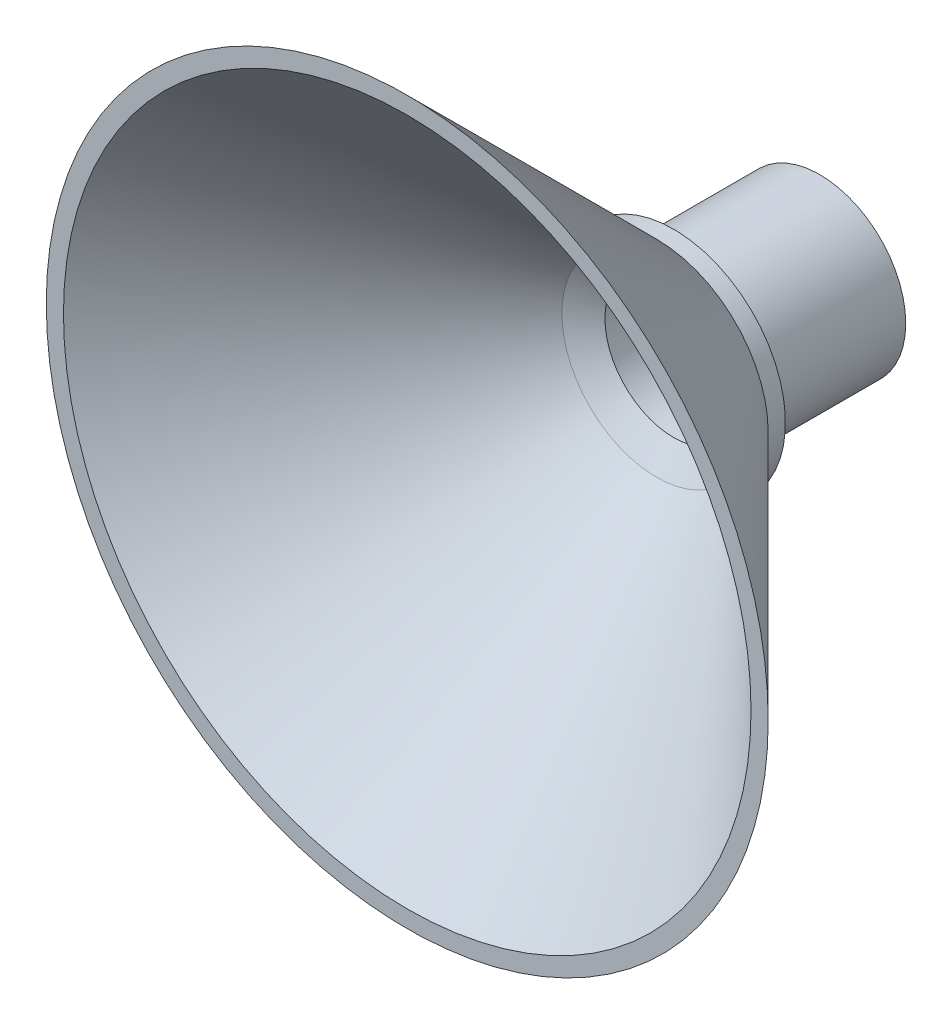
ISO-10303-21;
HEADER;
FILE_DESCRIPTION(('STEP AP214'),'2;1');
FILE_NAME('part.step','',(''),(''),'','','');
FILE_SCHEMA(('AUTOMOTIVE_DESIGN { 1 0 10303 214 1 1 1 1 }'));
ENDSEC;
DATA;
#1=APPLICATION_CONTEXT('core data for automotive mechanical design processes');
#2=APPLICATION_PROTOCOL_DEFINITION('international standard','automotive_design',2000,#1);
#3=PRODUCT_CONTEXT('',#1,'mechanical');
#4=PRODUCT('Part','Part','',(#3));
#5=PRODUCT_RELATED_PRODUCT_CATEGORY('part','',(#4));
#6=PRODUCT_DEFINITION_FORMATION('','',#4);
#7=PRODUCT_DEFINITION_CONTEXT('part definition',#1,'design');
#8=PRODUCT_DEFINITION('design','',#6,#7);
#9=PRODUCT_DEFINITION_SHAPE('','',#8);
#10=(LENGTH_UNIT() NAMED_UNIT(*) SI_UNIT(.MILLI.,.METRE.));
#11=(NAMED_UNIT(*) PLANE_ANGLE_UNIT() SI_UNIT($,.RADIAN.));
#12=(NAMED_UNIT(*) SI_UNIT($,.STERADIAN.) SOLID_ANGLE_UNIT());
#13=UNCERTAINTY_MEASURE_WITH_UNIT(LENGTH_MEASURE(1.E-05),#10,'distance_accuracy_value','');
#14=(GEOMETRIC_REPRESENTATION_CONTEXT(3) GLOBAL_UNCERTAINTY_ASSIGNED_CONTEXT((#13)) GLOBAL_UNIT_ASSIGNED_CONTEXT((#10,
#11,#12)) REPRESENTATION_CONTEXT('',''));
#15=CARTESIAN_POINT('',(0.,0.,0.));
#16=DIRECTION('',(0.,0.,1.));
#17=DIRECTION('',(1.,0.,0.));
#18=AXIS2_PLACEMENT_3D('',#15,#16,#17);
#19=CARTESIAN_POINT('',(0.,0.,0.));
#20=DIRECTION('',(0.,0.,1.));
#21=DIRECTION('',(1.,0.,0.));
#22=AXIS2_PLACEMENT_3D('',#19,#20,#21);
#23=PLANE('',#22);
#24=CARTESIAN_POINT('',(0.,0.,0.));
#25=DIRECTION('',(0.,0.,1.));
#26=DIRECTION('',(1.,0.,0.));
#27=AXIS2_PLACEMENT_3D('',#24,#25,#26);
#28=CIRCLE('',#27,10.);
#29=CARTESIAN_POINT('',(10.,0.,0.));
#30=VERTEX_POINT('',#29);
#31=EDGE_CURVE('E43',#30,#30,#28,.T.);
#32=ORIENTED_EDGE('',*,*,#31,.F.);
#33=EDGE_LOOP('',(#32));
#34=FACE_BOUND('',#33,.T.);
#35=CARTESIAN_POINT('',(0.,0.,0.));
#36=DIRECTION('',(0.,0.,1.));
#37=DIRECTION('',(1.,0.,0.));
#38=AXIS2_PLACEMENT_3D('',#35,#36,#37);
#39=CIRCLE('',#38,8.);
#40=CARTESIAN_POINT('',(8.,0.,0.));
#41=VERTEX_POINT('',#40);
#42=EDGE_CURVE('E50',#41,#41,#39,.T.);
#43=ORIENTED_EDGE('',*,*,#42,.T.);
#44=EDGE_LOOP('',(#43));
#45=FACE_BOUND('',#44,.T.);
#46=ADVANCED_FACE('F39',(#34,#45),#23,.F.);
#47=CARTESIAN_POINT('',(0.,0.,17.));
#48=DIRECTION('',(0.,0.,-1.));
#49=DIRECTION('',(-1.,0.,0.));
#50=AXIS2_PLACEMENT_3D('',#47,#48,#49);
#51=CYLINDRICAL_SURFACE('',#50,10.);
#52=CARTESIAN_POINT('',(0.,0.,17.));
#53=DIRECTION('',(0.,0.,1.));
#54=DIRECTION('',(1.,0.,0.));
#55=AXIS2_PLACEMENT_3D('',#52,#53,#54);
#56=CIRCLE('',#55,10.);
#57=CARTESIAN_POINT('',(10.,0.,17.));
#58=VERTEX_POINT('',#57);
#59=EDGE_CURVE('E10',#58,#58,#56,.T.);
#60=ORIENTED_EDGE('',*,*,#59,.F.);
#61=EDGE_LOOP('',(#60));
#62=FACE_BOUND('',#61,.T.);
#63=ORIENTED_EDGE('',*,*,#31,.T.);
#64=EDGE_LOOP('',(#63));
#65=FACE_BOUND('',#64,.T.);
#66=ADVANCED_FACE('F41',(#62,#65),#51,.T.);
#67=CARTESIAN_POINT('',(0.,0.,17.));
#68=DIRECTION('',(0.,0.,-1.));
#69=DIRECTION('',(-1.,0.,0.));
#70=AXIS2_PLACEMENT_3D('',#67,#68,#69);
#71=CYLINDRICAL_SURFACE('',#70,8.);
#72=CARTESIAN_POINT('',(0.,0.,17.));
#73=DIRECTION('',(0.,0.,-1.));
#74=DIRECTION('',(-1.,0.,0.));
#75=AXIS2_PLACEMENT_3D('',#72,#73,#74);
#76=CIRCLE('',#75,8.);
#77=CARTESIAN_POINT('',(-8.,0.,17.));
#78=VERTEX_POINT('',#77);
#79=EDGE_CURVE('E60',#78,#78,#76,.T.);
#80=ORIENTED_EDGE('',*,*,#79,.F.);
#81=EDGE_LOOP('',(#80));
#82=FACE_BOUND('',#81,.T.);
#83=ORIENTED_EDGE('',*,*,#42,.F.);
#84=EDGE_LOOP('',(#83));
#85=FACE_BOUND('',#84,.T.);
#86=ADVANCED_FACE('F90',(#82,#85),#71,.F.);
#87=CARTESIAN_POINT('',(-10.,0.,17.));
#88=DIRECTION('',(0.,0.,-1.));
#89=DIRECTION('',(-1.,0.,0.));
#90=AXIS2_PLACEMENT_3D('',#87,#88,#89);
#91=PLANE('',#90);
#92=ORIENTED_EDGE('',*,*,#59,.T.);
#93=EDGE_LOOP('',(#92));
#94=FACE_BOUND('',#93,.T.);
#95=CARTESIAN_POINT('',(0.,0.,17.));
#96=DIRECTION('',(0.,0.,-1.));
#97=DIRECTION('',(-1.,0.,0.));
#98=AXIS2_PLACEMENT_3D('',#95,#96,#97);
#99=CIRCLE('',#98,13.);
#100=CARTESIAN_POINT('',(-13.,0.,17.));
#101=VERTEX_POINT('',#100);
#102=EDGE_CURVE('E54',#101,#101,#99,.T.);
#103=ORIENTED_EDGE('',*,*,#102,.T.);
#104=EDGE_LOOP('',(#103));
#105=FACE_BOUND('',#104,.T.);
#106=ADVANCED_FACE('F97',(#94,#105),#91,.T.);
#107=CARTESIAN_POINT('',(0.,0.,0.));
#108=DIRECTION('',(0.,0.,-1.));
#109=DIRECTION('',(-1.,0.,0.));
#110=AXIS2_PLACEMENT_3D('',#107,#108,#109);
#111=CYLINDRICAL_SURFACE('',#110,13.);
#112=CARTESIAN_POINT('',(0.,0.,19.));
#113=DIRECTION('',(0.,0.,-1.));
#114=DIRECTION('',(-1.,0.,0.));
#115=AXIS2_PLACEMENT_3D('',#112,#113,#114);
#116=CIRCLE('',#115,13.);
#117=CARTESIAN_POINT('',(13.,0.,19.));
#118=VERTEX_POINT('',#117);
#119=EDGE_CURVE('E63',#118,#118,#116,.T.);
#120=ORIENTED_EDGE('',*,*,#119,.T.);
#121=EDGE_LOOP('',(#120));
#122=FACE_BOUND('',#121,.T.);
#123=ORIENTED_EDGE('',*,*,#102,.F.);
#124=EDGE_LOOP('',(#123));
#125=FACE_BOUND('',#124,.T.);
#126=ADVANCED_FACE('F101',(#122,#125),#111,.T.);
#127=CARTESIAN_POINT('',(0.,0.,19.));
#128=DIRECTION('',(0.,0.,1.));
#129=DIRECTION('',(1.,0.,0.));
#130=AXIS2_PLACEMENT_3D('',#127,#128,#129);
#131=CONICAL_SURFACE('',#130,11.,0.982793723247329);
#132=ORIENTED_EDGE('',*,*,#79,.T.);
#133=EDGE_LOOP('',(#132));
#134=FACE_BOUND('',#133,.T.);
#135=CARTESIAN_POINT('',(0.,0.,19.));
#136=DIRECTION('',(0.,0.,-1.));
#137=DIRECTION('',(-1.,0.,0.));
#138=AXIS2_PLACEMENT_3D('',#135,#136,#137);
#139=CIRCLE('',#138,11.);
#140=CARTESIAN_POINT('',(11.,0.,19.));
#141=VERTEX_POINT('',#140);
#142=EDGE_CURVE('E57',#141,#141,#139,.T.);
#143=ORIENTED_EDGE('',*,*,#142,.F.);
#144=EDGE_LOOP('',(#143));
#145=FACE_BOUND('',#144,.T.);
#146=ADVANCED_FACE('F104',(#134,#145),#131,.F.);
#147=CARTESIAN_POINT('',(0.,0.,19.));
#148=DIRECTION('',(0.,0.,1.));
#149=DIRECTION('',(1.,0.,0.));
#150=AXIS2_PLACEMENT_3D('',#147,#148,#149);
#151=CONICAL_SURFACE('',#150,13.,0.785398163397446);
#152=CARTESIAN_POINT('',(0.,0.,48.0000000000001));
#153=DIRECTION('',(0.,0.,-1.));
#154=DIRECTION('',(-1.,0.,0.));
#155=AXIS2_PLACEMENT_3D('',#152,#153,#154);
#156=CIRCLE('',#155,42.);
#157=CARTESIAN_POINT('',(42.,0.,48.0000000000001));
#158=VERTEX_POINT('',#157);
#159=EDGE_CURVE('E66',#158,#158,#156,.T.);
#160=CARTESIAN_POINT('',(42.,0.,48.0000000000001));
#161=CARTESIAN_POINT('',(41.6979166666667,0.,47.6979166666668));
#162=CARTESIAN_POINT('',(41.3958333333333,0.,47.3958333333334));
#163=CARTESIAN_POINT('',(40.7916666666667,0.,46.7916666666668));
#164=CARTESIAN_POINT('',(40.4895833333333,0.,46.4895833333334));
#165=CARTESIAN_POINT('',(39.8854166666667,0.,45.8854166666668));
#166=CARTESIAN_POINT('',(39.5833333333333,0.,45.5833333333334));
#167=CARTESIAN_POINT('',(38.9791666666667,0.,44.9791666666668));
#168=CARTESIAN_POINT('',(38.6770833333333,0.,44.6770833333334));
#169=CARTESIAN_POINT('',(38.0729166666667,0.,44.0729166666668));
#170=CARTESIAN_POINT('',(37.7708333333333,0.,43.7708333333334));
#171=CARTESIAN_POINT('',(37.1666666666667,0.,43.1666666666668));
#172=CARTESIAN_POINT('',(36.8645833333333,0.,42.8645833333334));
#173=CARTESIAN_POINT('',(36.2604166666667,0.,42.2604166666668));
#174=CARTESIAN_POINT('',(35.9583333333333,0.,41.9583333333334));
#175=CARTESIAN_POINT('',(35.3541666666667,0.,41.3541666666668));
#176=CARTESIAN_POINT('',(35.0520833333333,0.,41.0520833333334));
#177=CARTESIAN_POINT('',(34.4479166666667,0.,40.4479166666668));
#178=CARTESIAN_POINT('',(34.1458333333333,0.,40.1458333333334));
#179=CARTESIAN_POINT('',(33.5416666666667,0.,39.5416666666667));
#180=CARTESIAN_POINT('',(33.2395833333333,0.,39.2395833333334));
#181=CARTESIAN_POINT('',(32.6354166666667,0.,38.6354166666667));
#182=CARTESIAN_POINT('',(32.3333333333333,0.,38.3333333333334));
#183=CARTESIAN_POINT('',(31.7291666666667,0.,37.7291666666667));
#184=CARTESIAN_POINT('',(31.4270833333333,0.,37.4270833333334));
#185=CARTESIAN_POINT('',(30.8229166666667,0.,36.8229166666667));
#186=CARTESIAN_POINT('',(30.5208333333333,0.,36.5208333333334));
#187=CARTESIAN_POINT('',(29.9166666666667,0.,35.9166666666667));
#188=CARTESIAN_POINT('',(29.6145833333333,0.,35.6145833333334));
#189=CARTESIAN_POINT('',(29.0104166666667,0.,35.0104166666667));
#190=CARTESIAN_POINT('',(28.7083333333333,0.,34.7083333333334));
#191=CARTESIAN_POINT('',(28.1041666666667,0.,34.1041666666667));
#192=CARTESIAN_POINT('',(27.8020833333333,0.,33.8020833333334));
#193=CARTESIAN_POINT('',(27.1979166666667,0.,33.1979166666667));
#194=CARTESIAN_POINT('',(26.8958333333333,0.,32.8958333333334));
#195=CARTESIAN_POINT('',(26.2916666666667,0.,32.2916666666667));
#196=CARTESIAN_POINT('',(25.9895833333333,0.,31.9895833333334));
#197=CARTESIAN_POINT('',(25.3854166666667,0.,31.3854166666667));
#198=CARTESIAN_POINT('',(25.0833333333333,0.,31.0833333333334));
#199=CARTESIAN_POINT('',(24.4791666666667,0.,30.4791666666667));
#200=CARTESIAN_POINT('',(24.1770833333333,0.,30.1770833333334));
#201=CARTESIAN_POINT('',(23.5729166666667,0.,29.5729166666667));
#202=CARTESIAN_POINT('',(23.2708333333333,0.,29.2708333333334));
#203=CARTESIAN_POINT('',(22.6666666666667,0.,28.6666666666667));
#204=CARTESIAN_POINT('',(22.3645833333333,0.,28.3645833333334));
#205=CARTESIAN_POINT('',(21.7604166666667,0.,27.7604166666667));
#206=CARTESIAN_POINT('',(21.4583333333333,0.,27.4583333333334));
#207=CARTESIAN_POINT('',(20.8541666666667,0.,26.8541666666667));
#208=CARTESIAN_POINT('',(20.5520833333333,0.,26.5520833333334));
#209=CARTESIAN_POINT('',(19.9479166666667,0.,25.9479166666667));
#210=CARTESIAN_POINT('',(19.6458333333333,0.,25.6458333333334));
#211=CARTESIAN_POINT('',(19.0416666666667,0.,25.0416666666667));
#212=CARTESIAN_POINT('',(18.7395833333333,0.,24.7395833333334));
#213=CARTESIAN_POINT('',(18.1354166666667,0.,24.1354166666667));
#214=CARTESIAN_POINT('',(17.8333333333333,0.,23.8333333333334));
#215=CARTESIAN_POINT('',(17.2291666666667,0.,23.2291666666667));
#216=CARTESIAN_POINT('',(16.9270833333333,0.,22.9270833333333));
#217=CARTESIAN_POINT('',(16.3229166666667,0.,22.3229166666667));
#218=CARTESIAN_POINT('',(16.0208333333333,0.,22.0208333333333));
#219=CARTESIAN_POINT('',(15.4166666666667,0.,21.4166666666667));
#220=CARTESIAN_POINT('',(15.1145833333333,0.,21.1145833333333));
#221=CARTESIAN_POINT('',(14.5104166666667,0.,20.5104166666667));
#222=CARTESIAN_POINT('',(14.2083333333333,0.,20.2083333333333));
#223=CARTESIAN_POINT('',(13.6041666666667,0.,19.6041666666667));
#224=CARTESIAN_POINT('',(13.3020833333333,0.,19.3020833333333));
#225=CARTESIAN_POINT('',(13.,0.,19.));
#226=B_SPLINE_CURVE_WITH_KNOTS('',3,(#160,#161,#162,#163,#164,#165,#166,#167,#168,#169,#170,
#171,#172,#173,#174,#175,#176,#177,#178,#179,#180,#181,#182,#183,#184,#185,#186,#187,#188,#189,
#190,#191,#192,#193,#194,#195,#196,#197,#198,#199,#200,#201,#202,#203,#204,#205,#206,#207,#208,
#209,#210,#211,#212,#213,#214,#215,#216,#217,#218,#219,#220,#221,#222,#223,#224,#225),
.UNSPECIFIED.,.F.,.F.,(4,2,2,2,2,2,2,2,2,2,2,2,2,2,2,2,2,2,2,2,2,2,2,2,2,2,2,2,2,2,2,2,4),(0.,
1.28163104090062,2.56326208180124,3.84489312270187,5.12652416360248,6.4081552045031,
7.68978624540372,8.97141728630434,10.253048327205,11.5346793681056,12.8163104090062,
14.0979414499068,15.3795724908074,16.6612035317081,17.9428345726087,19.2244656135093,
20.5060966544099,21.7877276953105,23.0693587362112,24.3509897771118,25.6326208180124,
26.914251858913,28.1958828998136,29.4775139407143,30.7591449816149,32.0407760225155,
33.3224070634161,34.6040381043167,35.8856691452174,37.167300186118,38.4489312270186,
39.7305622679192,41.0121933088198),.UNSPECIFIED.);
#227=EDGE_CURVE('BSEAM83',#158,#118,#226,.T.);
#228=ORIENTED_EDGE('',*,*,#159,.T.);
#229=ORIENTED_EDGE('',*,*,#119,.F.);
#230=ORIENTED_EDGE('',*,*,#227,.T.);
#231=ORIENTED_EDGE('',*,*,#227,.F.);
#232=EDGE_LOOP('',(#228,#230,#229,#231));
#233=FACE_BOUND('',#232,.T.);
#234=ADVANCED_FACE('F83',(#233),#151,.T.);
#235=CARTESIAN_POINT('',(-42.,0.,48.0000000000001));
#236=DIRECTION('',(0.,0.,1.));
#237=DIRECTION('',(1.,0.,0.));
#238=AXIS2_PLACEMENT_3D('',#235,#236,#237);
#239=PLANE('',#238);
#240=CARTESIAN_POINT('',(0.,0.,48.0000000000001));
#241=DIRECTION('',(0.,0.,-1.));
#242=DIRECTION('',(-1.,0.,0.));
#243=AXIS2_PLACEMENT_3D('',#240,#241,#242);
#244=CIRCLE('',#243,40.);
#245=CARTESIAN_POINT('',(40.,0.,48.0000000000001));
#246=VERTEX_POINT('',#245);
#247=EDGE_CURVE('E69',#246,#246,#244,.T.);
#248=ORIENTED_EDGE('',*,*,#247,.T.);
#249=EDGE_LOOP('',(#248));
#250=FACE_BOUND('',#249,.T.);
#251=ORIENTED_EDGE('',*,*,#159,.F.);
#252=EDGE_LOOP('',(#251));
#253=FACE_BOUND('',#252,.T.);
#254=ADVANCED_FACE('F73',(#250,#253),#239,.T.);
#255=CARTESIAN_POINT('',(0.,0.,48.0000000000001));
#256=DIRECTION('',(0.,0.,1.));
#257=DIRECTION('',(1.,0.,0.));
#258=AXIS2_PLACEMENT_3D('',#255,#256,#257);
#259=CONICAL_SURFACE('',#258,40.,0.785398163397446);
#260=CARTESIAN_POINT('',(11.,0.,19.));
#261=CARTESIAN_POINT('',(11.3020833333333,0.,19.3020833333333));
#262=CARTESIAN_POINT('',(11.6041666666667,0.,19.6041666666667));
#263=CARTESIAN_POINT('',(12.2083333333333,0.,20.2083333333333));
#264=CARTESIAN_POINT('',(12.5104166666667,0.,20.5104166666667));
#265=CARTESIAN_POINT('',(13.1145833333333,0.,21.1145833333333));
#266=CARTESIAN_POINT('',(13.4166666666667,0.,21.4166666666667));
#267=CARTESIAN_POINT('',(14.0208333333333,0.,22.0208333333333));
#268=CARTESIAN_POINT('',(14.3229166666667,0.,22.3229166666667));
#269=CARTESIAN_POINT('',(14.9270833333333,0.,22.9270833333333));
#270=CARTESIAN_POINT('',(15.2291666666667,0.,23.2291666666667));
#271=CARTESIAN_POINT('',(15.8333333333333,0.,23.8333333333334));
#272=CARTESIAN_POINT('',(16.1354166666667,0.,24.1354166666667));
#273=CARTESIAN_POINT('',(16.7395833333333,0.,24.7395833333334));
#274=CARTESIAN_POINT('',(17.0416666666667,0.,25.0416666666667));
#275=CARTESIAN_POINT('',(17.6458333333333,0.,25.6458333333334));
#276=CARTESIAN_POINT('',(17.9479166666667,0.,25.9479166666667));
#277=CARTESIAN_POINT('',(18.5520833333333,0.,26.5520833333334));
#278=CARTESIAN_POINT('',(18.8541666666667,0.,26.8541666666667));
#279=CARTESIAN_POINT('',(19.4583333333333,0.,27.4583333333334));
#280=CARTESIAN_POINT('',(19.7604166666667,0.,27.7604166666667));
#281=CARTESIAN_POINT('',(20.3645833333333,0.,28.3645833333334));
#282=CARTESIAN_POINT('',(20.6666666666667,0.,28.6666666666667));
#283=CARTESIAN_POINT('',(21.2708333333333,0.,29.2708333333334));
#284=CARTESIAN_POINT('',(21.5729166666667,0.,29.5729166666667));
#285=CARTESIAN_POINT('',(22.1770833333333,0.,30.1770833333334));
#286=CARTESIAN_POINT('',(22.4791666666667,0.,30.4791666666667));
#287=CARTESIAN_POINT('',(23.0833333333333,0.,31.0833333333334));
#288=CARTESIAN_POINT('',(23.3854166666667,0.,31.3854166666667));
#289=CARTESIAN_POINT('',(23.9895833333333,0.,31.9895833333334));
#290=CARTESIAN_POINT('',(24.2916666666667,0.,32.2916666666667));
#291=CARTESIAN_POINT('',(24.8958333333333,0.,32.8958333333334));
#292=CARTESIAN_POINT('',(25.1979166666667,0.,33.1979166666667));
#293=CARTESIAN_POINT('',(25.8020833333333,0.,33.8020833333334));
#294=CARTESIAN_POINT('',(26.1041666666667,0.,34.1041666666667));
#295=CARTESIAN_POINT('',(26.7083333333333,0.,34.7083333333334));
#296=CARTESIAN_POINT('',(27.0104166666667,0.,35.0104166666667));
#297=CARTESIAN_POINT('',(27.6145833333333,0.,35.6145833333334));
#298=CARTESIAN_POINT('',(27.9166666666667,0.,35.9166666666667));
#299=CARTESIAN_POINT('',(28.5208333333333,0.,36.5208333333334));
#300=CARTESIAN_POINT('',(28.8229166666667,0.,36.8229166666667));
#301=CARTESIAN_POINT('',(29.4270833333333,0.,37.4270833333334));
#302=CARTESIAN_POINT('',(29.7291666666667,0.,37.7291666666667));
#303=CARTESIAN_POINT('',(30.3333333333333,0.,38.3333333333334));
#304=CARTESIAN_POINT('',(30.6354166666667,0.,38.6354166666667));
#305=CARTESIAN_POINT('',(31.2395833333333,0.,39.2395833333334));
#306=CARTESIAN_POINT('',(31.5416666666667,0.,39.5416666666667));
#307=CARTESIAN_POINT('',(32.1458333333333,0.,40.1458333333334));
#308=CARTESIAN_POINT('',(32.4479166666667,0.,40.4479166666668));
#309=CARTESIAN_POINT('',(33.0520833333333,0.,41.0520833333334));
#310=CARTESIAN_POINT('',(33.3541666666667,0.,41.3541666666668));
#311=CARTESIAN_POINT('',(33.9583333333333,0.,41.9583333333334));
#312=CARTESIAN_POINT('',(34.2604166666667,0.,42.2604166666668));
#313=CARTESIAN_POINT('',(34.8645833333333,0.,42.8645833333334));
#314=CARTESIAN_POINT('',(35.1666666666667,0.,43.1666666666668));
#315=CARTESIAN_POINT('',(35.7708333333333,0.,43.7708333333334));
#316=CARTESIAN_POINT('',(36.0729166666667,0.,44.0729166666668));
#317=CARTESIAN_POINT('',(36.6770833333333,0.,44.6770833333334));
#318=CARTESIAN_POINT('',(36.9791666666667,0.,44.9791666666668));
#319=CARTESIAN_POINT('',(37.5833333333333,0.,45.5833333333334));
#320=CARTESIAN_POINT('',(37.8854166666667,0.,45.8854166666668));
#321=CARTESIAN_POINT('',(38.4895833333333,0.,46.4895833333334));
#322=CARTESIAN_POINT('',(38.7916666666667,0.,46.7916666666668));
#323=CARTESIAN_POINT('',(39.3958333333333,0.,47.3958333333334));
#324=CARTESIAN_POINT('',(39.6979166666667,0.,47.6979166666668));
#325=CARTESIAN_POINT('',(40.,0.,48.0000000000001));
#326=B_SPLINE_CURVE_WITH_KNOTS('',3,(#260,#261,#262,#263,#264,#265,#266,#267,#268,#269,#270,
#271,#272,#273,#274,#275,#276,#277,#278,#279,#280,#281,#282,#283,#284,#285,#286,#287,#288,#289,
#290,#291,#292,#293,#294,#295,#296,#297,#298,#299,#300,#301,#302,#303,#304,#305,#306,#307,#308,
#309,#310,#311,#312,#313,#314,#315,#316,#317,#318,#319,#320,#321,#322,#323,#324,#325),
.UNSPECIFIED.,.F.,.F.,(4,2,2,2,2,2,2,2,2,2,2,2,2,2,2,2,2,2,2,2,2,2,2,2,2,2,2,2,2,2,2,2,4),(0.,
1.28163104090062,2.56326208180124,3.84489312270186,5.12652416360248,6.4081552045031,
7.68978624540372,8.97141728630434,10.253048327205,11.5346793681056,12.8163104090062,
14.0979414499068,15.3795724908074,16.6612035317081,17.9428345726087,19.2244656135093,
20.5060966544099,21.7877276953105,23.0693587362112,24.3509897771118,25.6326208180124,
26.914251858913,28.1958828998136,29.4775139407143,30.7591449816149,32.0407760225155,
33.3224070634161,34.6040381043167,35.8856691452174,37.167300186118,38.4489312270186,
39.7305622679192,41.0121933088198),.UNSPECIFIED.);
#327=EDGE_CURVE('BSEAM76',#141,#246,#326,.T.);
#328=ORIENTED_EDGE('',*,*,#142,.T.);
#329=ORIENTED_EDGE('',*,*,#247,.F.);
#330=ORIENTED_EDGE('',*,*,#327,.T.);
#331=ORIENTED_EDGE('',*,*,#327,.F.);
#332=EDGE_LOOP('',(#328,#330,#329,#331));
#333=FACE_BOUND('',#332,.T.);
#334=ADVANCED_FACE('F76',(#333),#259,.F.);
#335=CLOSED_SHELL('',(#46,#66,#86,#106,#126,#146,#234,#254,#334));
#336=MANIFOLD_SOLID_BREP('B2',#335);
#337=ADVANCED_BREP_SHAPE_REPRESENTATION('',(#18,#336),#14);
#338=SHAPE_DEFINITION_REPRESENTATION(#9,#337);
ENDSEC;
END-ISO-10303-21;
